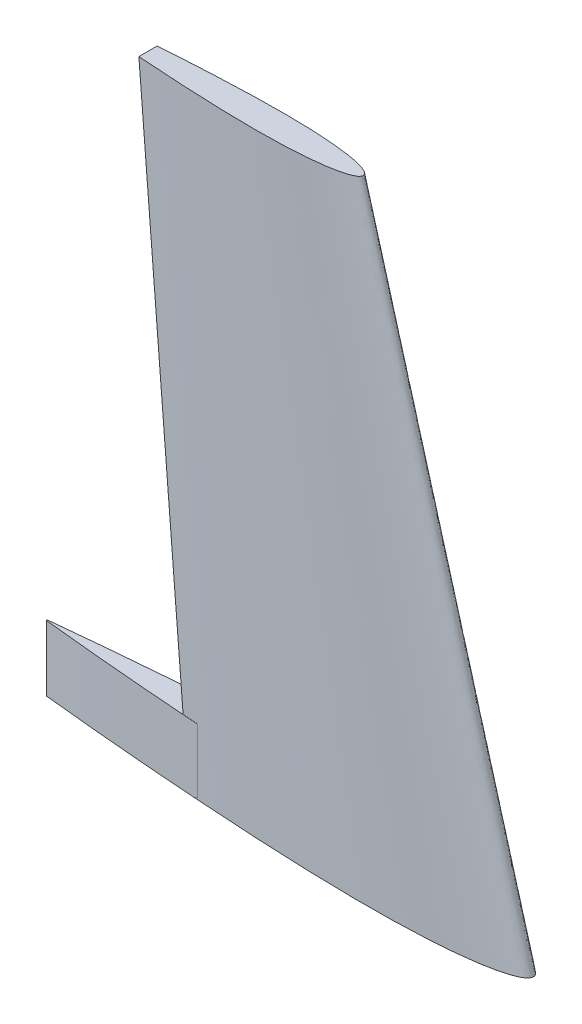
ISO-10303-21;
HEADER;
FILE_DESCRIPTION(('STEP AP214'),'2;1');
FILE_NAME('part.step','',(''),(''),'','','');
FILE_SCHEMA(('AUTOMOTIVE_DESIGN { 1 0 10303 214 1 1 1 1 }'));
ENDSEC;
DATA;
#1=APPLICATION_CONTEXT('core data for automotive mechanical design processes');
#2=APPLICATION_PROTOCOL_DEFINITION('international standard','automotive_design',2000,#1);
#3=PRODUCT_CONTEXT('',#1,'mechanical');
#4=PRODUCT('Part','Part','',(#3));
#5=PRODUCT_RELATED_PRODUCT_CATEGORY('part','',(#4));
#6=PRODUCT_DEFINITION_FORMATION('','',#4);
#7=PRODUCT_DEFINITION_CONTEXT('part definition',#1,'design');
#8=PRODUCT_DEFINITION('design','',#6,#7);
#9=PRODUCT_DEFINITION_SHAPE('','',#8);
#10=(LENGTH_UNIT() NAMED_UNIT(*) SI_UNIT(.MILLI.,.METRE.));
#11=(NAMED_UNIT(*) PLANE_ANGLE_UNIT() SI_UNIT($,.RADIAN.));
#12=(NAMED_UNIT(*) SI_UNIT($,.STERADIAN.) SOLID_ANGLE_UNIT());
#13=UNCERTAINTY_MEASURE_WITH_UNIT(LENGTH_MEASURE(1.E-05),#10,'distance_accuracy_value','');
#14=(GEOMETRIC_REPRESENTATION_CONTEXT(3) GLOBAL_UNCERTAINTY_ASSIGNED_CONTEXT((#13)) GLOBAL_UNIT_ASSIGNED_CONTEXT((#10,
#11,#12)) REPRESENTATION_CONTEXT('',''));
#15=CARTESIAN_POINT('',(0.,0.,0.));
#16=DIRECTION('',(0.,0.,1.));
#17=DIRECTION('',(1.,0.,0.));
#18=AXIS2_PLACEMENT_3D('',#15,#16,#17);
#19=CARTESIAN_POINT('',(-105.416624966874,-9.4452933315154,0.));
#20=DIRECTION('',(0.996009959146229,0.0892421496913133,0.));
#21=DIRECTION('',(-0.0892421496913133,0.996009959146229,0.));
#22=AXIS2_PLACEMENT_3D('',#19,#20,#21);
#23=PLANE('',#22);
#24=DIRECTION('',(0.,0.,-1.));
#25=VECTOR('',#24,1.);
#26=CARTESIAN_POINT('',(-108.144512775562,21.,0.));
#27=LINE('',#26,#25);
#28=CARTESIAN_POINT('',(-108.144512775562,21.,4.34405090672924));
#29=VERTEX_POINT('',#28);
#30=CARTESIAN_POINT('',(-108.144512775562,21.,-4.34405090672924));
#31=VERTEX_POINT('',#30);
#32=EDGE_CURVE('E135',#29,#31,#27,.T.);
#33=ORIENTED_EDGE('',*,*,#32,.F.);
#34=DIRECTION('',(-0.089239254238316,0.995977643698523,-0.00805535571697361));
#35=VECTOR('',#34,1.);
#36=CARTESIAN_POINT('',(-106.26292,0.,4.51389655650534));
#37=LINE('',#36,#35);
#38=CARTESIAN_POINT('',(-123.765048,195.337,2.93403276172847));
#39=VERTEX_POINT('',#38);
#40=EDGE_CURVE('E147',#29,#39,#37,.T.);
#41=ORIENTED_EDGE('',*,*,#40,.T.);
#42=DIRECTION('',(0.,0.,1.));
#43=VECTOR('',#42,1.);
#44=CARTESIAN_POINT('',(-123.765048,195.337,-2.93403276172847));
#45=LINE('',#44,#43);
#46=CARTESIAN_POINT('',(-123.765048,195.337,-2.93403276172847));
#47=VERTEX_POINT('',#46);
#48=EDGE_CURVE('E155',#47,#39,#45,.T.);
#49=ORIENTED_EDGE('',*,*,#48,.F.);
#50=DIRECTION('',(-0.089239254238316,0.995977643698523,0.00805535571697361));
#51=VECTOR('',#50,1.);
#52=CARTESIAN_POINT('',(-106.26292,0.,-4.51389655650534));
#53=LINE('',#52,#51);
#54=EDGE_CURVE('E148',#31,#47,#53,.T.);
#55=ORIENTED_EDGE('',*,*,#54,.F.);
#56=EDGE_LOOP('',(#33,#41,#49,#55));
#57=FACE_BOUND('',#56,.T.);
#58=ADVANCED_FACE('F41',(#57),#23,.F.);
#59=CARTESIAN_POINT('',(-106.26292,0.,4.51389655650534));
#60=CARTESIAN_POINT('',(-123.765048,195.337,2.93403276172847));
#61=CARTESIAN_POINT('',(-104.935148385792,0.,4.60883852491694));
#62=CARTESIAN_POINT('',(-122.901996450765,195.337,2.99574504119601));
#63=CARTESIAN_POINT('',(-100.975243384421,0.,4.89199051546261));
#64=CARTESIAN_POINT('',(-120.328058199873,195.337,3.1797938350507));
#65=CARTESIAN_POINT('',(-94.3217202276288,0.,5.32075207551032));
#66=CARTESIAN_POINT('',(-116.003268147959,195.337,3.45848884908171));
#67=CARTESIAN_POINT('',(-86.273621162137,0.,5.79664795875354));
#68=CARTESIAN_POINT('',(-110.772003755389,195.337,3.7678211731898));
#69=CARTESIAN_POINT('',(-78.136149259993,0.,6.21614827745477));
#70=CARTESIAN_POINT('',(-105.482647018995,195.337,4.0404963803456));
#71=CARTESIAN_POINT('',(-69.9986072735361,0.,6.56668765709037));
#72=CARTESIAN_POINT('',(-100.193244727798,195.337,4.26834697710874));
#73=CARTESIAN_POINT('',(-61.9500363293575,0.,6.83232813720469));
#74=CARTESIAN_POINT('',(-94.9616736140824,195.337,4.44101328918305));
#75=CARTESIAN_POINT('',(-54.0785615843828,0.,6.99901332093482));
#76=CARTESIAN_POINT('',(-89.8452150298488,195.337,4.54935865860763));
#77=CARTESIAN_POINT('',(-46.4703435339196,0.,7.0542730799558));
#78=CARTESIAN_POINT('',(-84.8998732970477,195.337,4.58527750197127));
#79=CARTESIAN_POINT('',(-39.208658660567,0.,6.98847693971698));
#80=CARTESIAN_POINT('',(-80.1797781293685,195.337,4.54251001081604));
#81=CARTESIAN_POINT('',(-32.3729558054138,0.,6.79560836935339));
#82=CARTESIAN_POINT('',(-75.7365712735189,195.337,4.4171454400797));
#83=CARTESIAN_POINT('',(-26.0379974742425,0.,6.47382885938637));
#84=CARTESIAN_POINT('',(-71.6188483582576,195.337,4.20798875860114));
#85=CARTESIAN_POINT('',(-20.2728239547259,0.,6.02596361973304));
#86=CARTESIAN_POINT('',(-67.8714855705718,195.337,3.91687635282647));
#87=CARTESIAN_POINT('',(-15.1403124995387,0.,5.45870010366084));
#88=CARTESIAN_POINT('',(-64.5353531247002,195.337,3.54815506737955));
#89=CARTESIAN_POINT('',(-10.6946859398368,0.,4.78429969624304));
#90=CARTESIAN_POINT('',(-61.6456958608939,195.337,3.10979480255797));
#91=CARTESIAN_POINT('',(-6.98447600208662,0.,4.01326202878222));
#92=CARTESIAN_POINT('',(-59.2340594013563,195.337,2.60862031870844));
#93=CARTESIAN_POINT('',(-4.03684471242268,0.,3.17208660895619));
#94=CARTESIAN_POINT('',(-57.3180990630747,195.337,2.06185629582153));
#95=CARTESIAN_POINT('',(-1.88332812067288,0.,2.24853682955961));
#96=CARTESIAN_POINT('',(-55.9183132784374,195.337,1.46154893921374));
#97=CARTESIAN_POINT('',(-0.448695997297463,0.,1.29439280704104));
#98=CARTESIAN_POINT('',(-54.9858023982434,195.337,0.841355324576678));
#99=CARTESIAN_POINT('',(0.185503199903706,0.,0.));
#100=CARTESIAN_POINT('',(-54.5735729200626,195.337,0.));
#101=CARTESIAN_POINT('',(-0.448695997297476,0.,-1.29439280704106));
#102=CARTESIAN_POINT('',(-54.9858023982434,195.337,-0.841355324576682));
#103=CARTESIAN_POINT('',(-1.88332812067285,0.,-2.24853682955959));
#104=CARTESIAN_POINT('',(-55.9183132784373,195.337,-1.46154893921374));
#105=CARTESIAN_POINT('',(-4.03684471242271,0.,-3.17208660895621));
#106=CARTESIAN_POINT('',(-57.3180990630747,195.337,-2.06185629582153));
#107=CARTESIAN_POINT('',(-6.9844760020866,0.,-4.01326202878221));
#108=CARTESIAN_POINT('',(-59.2340594013563,195.337,-2.60862031870844));
#109=CARTESIAN_POINT('',(-10.6946859398368,0.,-4.78429969624304));
#110=CARTESIAN_POINT('',(-61.6456958608939,195.337,-3.10979480255797));
#111=CARTESIAN_POINT('',(-15.1403124995387,0.,-5.45870010366084));
#112=CARTESIAN_POINT('',(-64.5353531247002,195.337,-3.54815506737955));
#113=CARTESIAN_POINT('',(-20.2728239547259,0.,-6.02596361973303));
#114=CARTESIAN_POINT('',(-67.8714855705718,195.337,-3.91687635282647));
#115=CARTESIAN_POINT('',(-26.0379974742425,0.,-6.47382885938637));
#116=CARTESIAN_POINT('',(-71.6188483582576,195.337,-4.20798875860114));
#117=CARTESIAN_POINT('',(-32.3729558054138,0.,-6.79560836935339));
#118=CARTESIAN_POINT('',(-75.7365712735189,195.337,-4.4171454400797));
#119=CARTESIAN_POINT('',(-39.208658660567,0.,-6.98847693971698));
#120=CARTESIAN_POINT('',(-80.1797781293685,195.337,-4.54251001081604));
#121=CARTESIAN_POINT('',(-46.4703435339196,0.,-7.0542730799558));
#122=CARTESIAN_POINT('',(-84.8998732970477,195.337,-4.58527750197127));
#123=CARTESIAN_POINT('',(-54.0785615843828,0.,-6.99901332093482));
#124=CARTESIAN_POINT('',(-89.8452150298488,195.337,-4.54935865860763));
#125=CARTESIAN_POINT('',(-61.9500363293575,0.,-6.83232813720468));
#126=CARTESIAN_POINT('',(-94.9616736140824,195.337,-4.44101328918305));
#127=CARTESIAN_POINT('',(-69.9986072735361,0.,-6.56668765709037));
#128=CARTESIAN_POINT('',(-100.193244727798,195.337,-4.26834697710874));
#129=CARTESIAN_POINT('',(-78.136149259993,0.,-6.21614827745477));
#130=CARTESIAN_POINT('',(-105.482647018995,195.337,-4.0404963803456));
#131=CARTESIAN_POINT('',(-86.273621162137,0.,-5.79664795875354));
#132=CARTESIAN_POINT('',(-110.772003755389,195.337,-3.7678211731898));
#133=CARTESIAN_POINT('',(-94.3217202276288,0.,-5.32075207551033));
#134=CARTESIAN_POINT('',(-116.003268147959,195.337,-3.45848884908171));
#135=CARTESIAN_POINT('',(-100.975243384421,0.,-4.89199051546262));
#136=CARTESIAN_POINT('',(-120.328058199873,195.337,-3.1797938350507));
#137=CARTESIAN_POINT('',(-104.935148385792,0.,-4.60883852491694));
#138=CARTESIAN_POINT('',(-122.901996450765,195.337,-2.99574504119601));
#139=CARTESIAN_POINT('',(-106.26292,0.,-4.51389655650534));
#140=CARTESIAN_POINT('',(-123.765048,195.337,-2.93403276172847));
#141=B_SPLINE_SURFACE_WITH_KNOTS('',3,1,((#59,#60),(#61,#62),(#63,#64),(#65,#66),(#67,#68),(#69,
#70),(#71,#72),(#73,#74),(#75,#76),(#77,#78),(#79,#80),(#81,#82),(#83,#84),(#85,#86),(#87,#88),
(#89,#90),(#91,#92),(#93,#94),(#95,#96),(#97,#98),(#99,#100),(#101,#102),(#103,#104),(#105,
#106),(#107,#108),(#109,#110),(#111,#112),(#113,#114),(#115,#116),(#117,#118),(#119,#120),(#121,
#122),(#123,#124),(#125,#126),(#127,#128),(#129,#130),(#131,#132),(#133,#134),(#135,#136),(#137,
#138),(#139,#140)),.UNSPECIFIED.,.F.,.F.,.F.,(4,1,1,1,1,1,1,1,1,1,1,1,1,1,1,1,1,1,1,1,1,1,1,1,1,
1,1,1,1,1,1,1,1,1,1,1,1,1,4),(2,2),(0.,0.0184991990313921,0.0551714391103743,0.0926551947459052,
0.130538861378944,0.168407204268983,0.205846371784387,0.242448967142613,0.277819055280114,
0.31157698184847,0.343363918285861,0.372846133093968,0.399719140493533,0.423712132827816,
0.44459359078009,0.462180115204489,0.476353861047873,0.487105624794223,0.494669112548724,0.5,
0.505330887451276,0.512894375205777,0.523646138952127,0.537819884795511,0.55540640921991,
0.576287867172184,0.600280859506467,0.627153866906032,0.656636081714139,0.68842301815153,
0.722180944719886,0.757551032857387,0.794153628215613,0.831592795731017,0.869461138621057,
0.907344805254095,0.944828560889626,0.981500800968608,1.),(0.,1.),.UNSPECIFIED.);
#142=CARTESIAN_POINT('',(-103.13754,21.,4.69543432229981));
#143=CARTESIAN_POINT('',(-103.13754,20.0316183741775,4.69741197071201));
#144=CARTESIAN_POINT('',(-103.13754,19.0632367143761,4.69937306409232));
#145=CARTESIAN_POINT('',(-103.13754,14.221328243875,4.70909746222528));
#146=CARTESIAN_POINT('',(-103.13754,10.3478009421188,4.71661756062393));
#147=CARTESIAN_POINT('',(-103.13754,4.49002432531027,4.72763061578024));
#148=CARTESIAN_POINT('',(-103.13754,2.50577533797844,4.73129880827757));
#149=CARTESIAN_POINT('',(-103.13754,0.521526244739116,4.73490759398345));
#150=B_SPLINE_CURVE_WITH_KNOTS('',3,(#142,#143,#144,#145,#146,#147,#148,#149),.UNSPECIFIED.,.F.,
.F.,(4,2,2,4),(0.,2.90515093603481,14.5257547035983,20.4785118321649),.UNSPECIFIED.);
#151=CARTESIAN_POINT('',(-103.13754,21.,4.69543432229981));
#152=VERTEX_POINT('',#151);
#153=CARTESIAN_POINT('',(-103.13754,0.521526244739116,4.73490759398345));
#154=VERTEX_POINT('',#153);
#155=EDGE_CURVE('E54',#152,#154,#150,.T.);
#156=CARTESIAN_POINT('',(-103.13754,0.521526244739116,4.73490759398345));
#157=CARTESIAN_POINT('',(-103.178156783246,0.51436931466218,4.73207748481404));
#158=CARTESIAN_POINT('',(-103.218534042624,0.505915928756793,4.7292640622419));
#159=CARTESIAN_POINT('',(-103.298635653167,0.486669806677132,4.72368263285552));
#160=CARTESIAN_POINT('',(-103.338361271005,0.475882387126029,4.72091453795705));
#161=CARTESIAN_POINT('',(-103.417146917797,0.452194215810133,4.71542457647914));
#162=CARTESIAN_POINT('',(-103.456207316936,0.439294684852946,4.7127026841916));
#163=CARTESIAN_POINT('',(-103.609836434362,0.384372556105459,4.70199672642774));
#164=CARTESIAN_POINT('',(-103.721815727972,0.334970481147947,4.69419224320251));
#165=CARTESIAN_POINT('',(-103.912290522944,0.238759417375553,4.68091408260757));
#166=CARTESIAN_POINT('',(-103.992105285487,0.194441502863226,4.67534918321501));
#167=CARTESIAN_POINT('',(-104.110056850754,0.12422479386811,4.66712356130507));
#168=CARTESIAN_POINT('',(-104.149240925758,0.100085733385048,4.66439067392685));
#169=CARTESIAN_POINT('',(-104.226955374551,0.0507754951375784,4.65896985281537));
#170=CARTESIAN_POINT('',(-104.265485782512,0.025604371562729,4.65628191673231));
#171=CARTESIAN_POINT('',(-104.303721706896,0.,4.65361417981223));
#172=B_SPLINE_CURVE_WITH_KNOTS('',3,(#156,#157,#158,#159,#160,#161,#162,#163,#164,#165,#166,
#167,#168,#169,#170,#171),.UNSPECIFIED.,.F.,.F.,(4,2,2,2,2,2,2,4),(0.,0.123980883727061,
0.247682273861098,0.371312414948054,0.738101097831173,1.01233903621264,1.15063335150311,
1.28892041478041),.UNSPECIFIED.);
#173=CARTESIAN_POINT('',(-104.303715246416,0.,4.65361463806408));
#174=VERTEX_POINT('',#173);
#175=EDGE_CURVE('E11',#154,#174,#172,.T.);
#176=CARTESIAN_POINT('',(-106.26292,0.,4.51389655650534));
#177=CARTESIAN_POINT('',(-104.935148385792,0.,4.60883852491694));
#178=CARTESIAN_POINT('',(-100.975243384421,0.,4.89199051546261));
#179=CARTESIAN_POINT('',(-94.3217202276288,0.,5.32075207551032));
#180=CARTESIAN_POINT('',(-86.273621162137,0.,5.79664795875354));
#181=CARTESIAN_POINT('',(-78.136149259993,0.,6.21614827745477));
#182=CARTESIAN_POINT('',(-69.9986072735361,0.,6.56668765709037));
#183=CARTESIAN_POINT('',(-61.9500363293575,0.,6.83232813720469));
#184=CARTESIAN_POINT('',(-54.0785615843828,0.,6.99901332093482));
#185=CARTESIAN_POINT('',(-46.4703435339196,0.,7.0542730799558));
#186=CARTESIAN_POINT('',(-39.208658660567,0.,6.98847693971698));
#187=CARTESIAN_POINT('',(-32.3729558054138,0.,6.79560836935339));
#188=CARTESIAN_POINT('',(-26.0379974742425,0.,6.47382885938637));
#189=CARTESIAN_POINT('',(-20.2728239547259,0.,6.02596361973304));
#190=CARTESIAN_POINT('',(-15.1403124995387,0.,5.45870010366084));
#191=CARTESIAN_POINT('',(-10.6946859398368,0.,4.78429969624304));
#192=CARTESIAN_POINT('',(-6.98447600208662,0.,4.01326202878222));
#193=CARTESIAN_POINT('',(-4.03684471242268,0.,3.17208660895619));
#194=CARTESIAN_POINT('',(-1.88332812067288,0.,2.24853682955961));
#195=CARTESIAN_POINT('',(-0.448695997297463,0.,1.29439280704104));
#196=CARTESIAN_POINT('',(0.185503199903706,0.,0.));
#197=CARTESIAN_POINT('',(-0.448695997297476,0.,-1.29439280704106));
#198=CARTESIAN_POINT('',(-1.88332812067285,0.,-2.24853682955959));
#199=CARTESIAN_POINT('',(-4.03684471242271,0.,-3.17208660895621));
#200=CARTESIAN_POINT('',(-6.9844760020866,0.,-4.01326202878221));
#201=CARTESIAN_POINT('',(-10.6946859398368,0.,-4.78429969624304));
#202=CARTESIAN_POINT('',(-15.1403124995387,0.,-5.45870010366084));
#203=CARTESIAN_POINT('',(-20.2728239547259,0.,-6.02596361973303));
#204=CARTESIAN_POINT('',(-26.0379974742425,0.,-6.47382885938637));
#205=CARTESIAN_POINT('',(-32.3729558054138,0.,-6.79560836935339));
#206=CARTESIAN_POINT('',(-39.208658660567,0.,-6.98847693971698));
#207=CARTESIAN_POINT('',(-46.4703435339196,0.,-7.0542730799558));
#208=CARTESIAN_POINT('',(-54.0785615843828,0.,-6.99901332093482));
#209=CARTESIAN_POINT('',(-61.9500363293575,0.,-6.83232813720468));
#210=CARTESIAN_POINT('',(-69.9986072735361,0.,-6.56668765709037));
#211=CARTESIAN_POINT('',(-78.136149259993,0.,-6.21614827745477));
#212=CARTESIAN_POINT('',(-86.273621162137,0.,-5.79664795875354));
#213=CARTESIAN_POINT('',(-94.3217202276288,0.,-5.32075207551033));
#214=CARTESIAN_POINT('',(-100.975243384421,0.,-4.89199051546262));
#215=CARTESIAN_POINT('',(-104.935148385792,0.,-4.60883852491694));
#216=CARTESIAN_POINT('',(-106.26292,0.,-4.51389655650534));
#217=B_SPLINE_CURVE_WITH_KNOTS('',3,(#176,#177,#178,#179,#180,#181,#182,#183,#184,#185,#186,
#187,#188,#189,#190,#191,#192,#193,#194,#195,#196,#197,#198,#199,#200,#201,#202,#203,#204,#205,
#206,#207,#208,#209,#210,#211,#212,#213,#214,#215,#216),.UNSPECIFIED.,.F.,.F.,(4,1,1,1,1,1,1,1,
1,1,1,1,1,1,1,1,1,1,1,1,1,1,1,1,1,1,1,1,1,1,1,1,1,1,1,1,1,1,4),(0.,0.0184991990313921,
0.0551714391103743,0.0926551947459052,0.130538861378944,0.168407204268983,0.205846371784387,
0.242448967142613,0.277819055280114,0.31157698184847,0.343363918285861,0.372846133093968,
0.399719140493533,0.423712132827816,0.44459359078009,0.462180115204489,0.476353861047873,
0.487105624794223,0.494669112548724,0.5,0.505330887451276,0.512894375205777,0.523646138952127,
0.537819884795511,0.55540640921991,0.576287867172184,0.600280859506467,0.627153866906032,
0.656636081714139,0.68842301815153,0.722180944719886,0.757551032857387,0.794153628215613,
0.831592795731017,0.869461138621057,0.907344805254095,0.944828560889626,0.981500800968608,1.),.UNSPECIFIED.);
#218=CARTESIAN_POINT('',(-104.303715246411,0.,-4.65361463806438));
#219=VERTEX_POINT('',#218);
#220=EDGE_CURVE('E138',#174,#219,#217,.T.);
#221=CARTESIAN_POINT('',(-104.3037217069,0.,-4.65361417981194));
#222=CARTESIAN_POINT('',(-104.25511896038,0.0325399247343756,-4.65700521512348));
#223=CARTESIAN_POINT('',(-104.206039961357,0.0643903190124317,-4.66042891689702));
#224=CARTESIAN_POINT('',(-104.106543814112,0.126507293520077,-4.66736863626147));
#225=CARTESIAN_POINT('',(-104.056121052507,0.156764818022792,-4.6708850400915));
#226=CARTESIAN_POINT('',(-103.953960233892,0.21519936765475,-4.67800864325919));
#227=CARTESIAN_POINT('',(-103.902219965956,0.243372536784147,-4.68161599510177));
#228=CARTESIAN_POINT('',(-103.798537128651,0.296536740983262,-4.68884400568155));
#229=CARTESIAN_POINT('',(-103.746623119664,0.321583406543829,-4.6924626904233));
#230=CARTESIAN_POINT('',(-103.641539411044,0.368648737873837,-4.69978695370347));
#231=CARTESIAN_POINT('',(-103.588371909745,0.390672300903657,-4.70349238004663));
#232=CARTESIAN_POINT('',(-103.480762582265,0.431147011764918,-4.71099156937413));
#233=CARTESIAN_POINT('',(-103.426322498756,0.44960275704963,-4.71478521152249));
#234=CARTESIAN_POINT('',(-103.332958802477,0.477372583453444,-4.72129098601125));
#235=CARTESIAN_POINT('',(-103.294352718741,0.487759721616174,-4.72398106712428));
#236=CARTESIAN_POINT('',(-103.21642288543,0.506356766048033,-4.72941116396306));
#237=CARTESIAN_POINT('',(-103.177096536772,0.514555690793071,-4.73215136043614));
#238=CARTESIAN_POINT('',(-103.13754,0.52152624474047,-4.73490759398343));
#239=B_SPLINE_CURVE_WITH_KNOTS('',3,(#221,#222,#223,#224,#225,#226,#227,#228,#229,#230,#231,
#232,#233,#234,#235,#236,#237,#238),.UNSPECIFIED.,.F.,.F.,(4,2,2,2,2,2,2,2,4),(0.,
0.175779532273966,0.352469322155728,0.529478208064806,0.702660019529497,0.875557888881678,
1.04823145662731,1.16837887674185,1.28911837658366),.UNSPECIFIED.);
#240=CARTESIAN_POINT('',(-103.13754,0.521526244739304,-4.73490759398345));
#241=VERTEX_POINT('',#240);
#242=EDGE_CURVE('E194',#219,#241,#239,.T.);
#243=CARTESIAN_POINT('',(-103.13754,0.521526244739304,-4.73490759398345));
#244=CARTESIAN_POINT('',(-103.13754,1.48990828486941,-4.73314460613786));
#245=CARTESIAN_POINT('',(-103.13754,2.45829030099775,-4.73136817566528));
#246=CARTESIAN_POINT('',(-103.13754,7.30020026072589,-4.72241613595554));
#247=CARTESIAN_POINT('',(-103.13754,11.1737278205509,-4.71503086471597));
#248=CARTESIAN_POINT('',(-103.13754,17.0315033850086,-4.70347245791399));
#249=CARTESIAN_POINT('',(-103.13754,19.0157517663189,-4.69948952433037));
#250=CARTESIAN_POINT('',(-103.13754,21.,-4.69543432229981));
#251=B_SPLINE_CURVE_WITH_KNOTS('',3,(#243,#244,#245,#246,#247,#248,#249,#250),.UNSPECIFIED.,.F.,
.F.,(4,2,2,4),(0.,2.90515093588889,14.5257547004785,20.4785118322834),.UNSPECIFIED.);
#252=CARTESIAN_POINT('',(-103.13754,21.,-4.69543432229981));
#253=VERTEX_POINT('',#252);
#254=EDGE_CURVE('E172',#241,#253,#251,.T.);
#255=CARTESIAN_POINT('',(-103.13754,21.,-4.69543432229981));
#256=CARTESIAN_POINT('',(-103.379083353659,21.,-4.67907808586213));
#257=CARTESIAN_POINT('',(-103.620619423123,21.,-4.66261433822258));
#258=CARTESIAN_POINT('',(-104.103677141591,21.,-4.62947768573136));
#259=CARTESIAN_POINT('',(-104.345198790599,21.,-4.61280478094315));
#260=CARTESIAN_POINT('',(-105.069742088525,21.,-4.56248114561015));
#261=CARTESIAN_POINT('',(-105.552742548489,21.,-4.52852546291567));
#262=CARTESIAN_POINT('',(-106.387202445099,21.,-4.46945418538356));
#263=CARTESIAN_POINT('',(-106.738669735355,21.,-4.44444897971668));
#264=CARTESIAN_POINT('',(-107.441595640007,21.,-4.39431318405807));
#265=CARTESIAN_POINT('',(-107.793054254397,21.,-4.36918259397414));
#266=CARTESIAN_POINT('',(-108.144512775562,21.,-4.34405090672924));
#267=B_SPLINE_CURVE_WITH_KNOTS('',3,(#255,#256,#257,#258,#259,#260,#261,#262,#263,#264,#265,
#266),.UNSPECIFIED.,.F.,.F.,(4,2,2,2,2,4),(0.,0.726289488694294,1.4525787570991,
2.90515591030999,3.96222290706964,5.01929068109569),.UNSPECIFIED.);
#268=EDGE_CURVE('E158',#253,#31,#267,.T.);
#269=CARTESIAN_POINT('',(-123.765048,195.337,2.93403276172847));
#270=CARTESIAN_POINT('',(-122.901996450765,195.337,2.99574504119601));
#271=CARTESIAN_POINT('',(-120.328058199873,195.337,3.1797938350507));
#272=CARTESIAN_POINT('',(-116.003268147959,195.337,3.45848884908171));
#273=CARTESIAN_POINT('',(-110.772003755389,195.337,3.7678211731898));
#274=CARTESIAN_POINT('',(-105.482647018995,195.337,4.0404963803456));
#275=CARTESIAN_POINT('',(-100.193244727798,195.337,4.26834697710874));
#276=CARTESIAN_POINT('',(-94.9616736140824,195.337,4.44101328918305));
#277=CARTESIAN_POINT('',(-89.8452150298488,195.337,4.54935865860763));
#278=CARTESIAN_POINT('',(-84.8998732970477,195.337,4.58527750197127));
#279=CARTESIAN_POINT('',(-80.1797781293685,195.337,4.54251001081604));
#280=CARTESIAN_POINT('',(-75.7365712735189,195.337,4.4171454400797));
#281=CARTESIAN_POINT('',(-71.6188483582576,195.337,4.20798875860114));
#282=CARTESIAN_POINT('',(-67.8714855705718,195.337,3.91687635282647));
#283=CARTESIAN_POINT('',(-64.5353531247002,195.337,3.54815506737955));
#284=CARTESIAN_POINT('',(-61.6456958608939,195.337,3.10979480255797));
#285=CARTESIAN_POINT('',(-59.2340594013563,195.337,2.60862031870844));
#286=CARTESIAN_POINT('',(-57.3180990630747,195.337,2.06185629582153));
#287=CARTESIAN_POINT('',(-55.9183132784374,195.337,1.46154893921374));
#288=CARTESIAN_POINT('',(-54.9858023982434,195.337,0.841355324576678));
#289=CARTESIAN_POINT('',(-54.5735729200626,195.337,0.));
#290=CARTESIAN_POINT('',(-54.9858023982434,195.337,-0.841355324576682));
#291=CARTESIAN_POINT('',(-55.9183132784373,195.337,-1.46154893921374));
#292=CARTESIAN_POINT('',(-57.3180990630747,195.337,-2.06185629582153));
#293=CARTESIAN_POINT('',(-59.2340594013563,195.337,-2.60862031870844));
#294=CARTESIAN_POINT('',(-61.6456958608939,195.337,-3.10979480255797));
#295=CARTESIAN_POINT('',(-64.5353531247002,195.337,-3.54815506737955));
#296=CARTESIAN_POINT('',(-67.8714855705718,195.337,-3.91687635282647));
#297=CARTESIAN_POINT('',(-71.6188483582576,195.337,-4.20798875860114));
#298=CARTESIAN_POINT('',(-75.7365712735189,195.337,-4.4171454400797));
#299=CARTESIAN_POINT('',(-80.1797781293685,195.337,-4.54251001081604));
#300=CARTESIAN_POINT('',(-84.8998732970477,195.337,-4.58527750197127));
#301=CARTESIAN_POINT('',(-89.8452150298488,195.337,-4.54935865860763));
#302=CARTESIAN_POINT('',(-94.9616736140824,195.337,-4.44101328918305));
#303=CARTESIAN_POINT('',(-100.193244727798,195.337,-4.26834697710874));
#304=CARTESIAN_POINT('',(-105.482647018995,195.337,-4.0404963803456));
#305=CARTESIAN_POINT('',(-110.772003755389,195.337,-3.7678211731898));
#306=CARTESIAN_POINT('',(-116.003268147959,195.337,-3.45848884908171));
#307=CARTESIAN_POINT('',(-120.328058199873,195.337,-3.1797938350507));
#308=CARTESIAN_POINT('',(-122.901996450765,195.337,-2.99574504119601));
#309=CARTESIAN_POINT('',(-123.765048,195.337,-2.93403276172847));
#310=B_SPLINE_CURVE_WITH_KNOTS('',3,(#269,#270,#271,#272,#273,#274,#275,#276,#277,#278,#279,
#280,#281,#282,#283,#284,#285,#286,#287,#288,#289,#290,#291,#292,#293,#294,#295,#296,#297,#298,
#299,#300,#301,#302,#303,#304,#305,#306,#307,#308,#309),.UNSPECIFIED.,.F.,.F.,(4,1,1,1,1,1,1,1,
1,1,1,1,1,1,1,1,1,1,1,1,1,1,1,1,1,1,1,1,1,1,1,1,1,1,1,1,1,1,4),(0.,0.0184991990313921,
0.0551714391103743,0.0926551947459052,0.130538861378944,0.168407204268983,0.205846371784387,
0.242448967142613,0.277819055280114,0.31157698184847,0.343363918285861,0.372846133093968,
0.399719140493533,0.423712132827816,0.44459359078009,0.462180115204489,0.476353861047873,
0.487105624794223,0.494669112548724,0.5,0.505330887451276,0.512894375205777,0.523646138952127,
0.537819884795511,0.55540640921991,0.576287867172184,0.600280859506467,0.627153866906032,
0.656636081714139,0.68842301815153,0.722180944719886,0.757551032857387,0.794153628215613,
0.831592795731017,0.869461138621057,0.907344805254095,0.944828560889626,0.981500800968608,1.),.UNSPECIFIED.);
#311=EDGE_CURVE('E153',#39,#47,#310,.T.);
#312=CARTESIAN_POINT('',(-108.144512775562,21.,4.34405090672924));
#313=CARTESIAN_POINT('',(-107.661553479157,21.,4.37858013999617));
#314=CARTESIAN_POINT('',(-107.178594438659,21.,4.41311632602083));
#315=CARTESIAN_POINT('',(-106.212653840045,21.,4.48186334680713));
#316=CARTESIAN_POINT('',(-105.729672281956,21.,4.51607418197067));
#317=CARTESIAN_POINT('',(-104.895174535368,21.,4.57460690605361));
#318=CARTESIAN_POINT('',(-104.543669340701,21.,4.59908509769259));
#319=CARTESIAN_POINT('',(-103.840628637794,21.,4.64760661180659));
#320=CARTESIAN_POINT('',(-103.489093129528,21.,4.67164993389062));
#321=CARTESIAN_POINT('',(-103.13754,21.,4.69543432229981));
#322=B_SPLINE_CURVE_WITH_KNOTS('',3,(#312,#313,#314,#315,#316,#317,#318,#319,#320,#321),
.UNSPECIFIED.,.F.,.F.,(4,2,2,2,4),(0.,1.45257659393113,2.90515139327907,3.96222054570458,
5.01929064850085),.UNSPECIFIED.);
#323=EDGE_CURVE('E64',#29,#152,#322,.T.);
#324=ORIENTED_EDGE('',*,*,#155,.T.);
#325=ORIENTED_EDGE('',*,*,#175,.T.);
#326=ORIENTED_EDGE('',*,*,#220,.T.);
#327=ORIENTED_EDGE('',*,*,#242,.T.);
#328=ORIENTED_EDGE('',*,*,#254,.T.);
#329=ORIENTED_EDGE('',*,*,#268,.T.);
#330=ORIENTED_EDGE('',*,*,#54,.T.);
#331=ORIENTED_EDGE('',*,*,#311,.F.);
#332=ORIENTED_EDGE('',*,*,#40,.F.);
#333=ORIENTED_EDGE('',*,*,#323,.T.);
#334=EDGE_LOOP('',(#324,#325,#326,#327,#328,#329,#330,#331,#332,#333));
#335=FACE_BOUND('',#334,.T.);
#336=ADVANCED_FACE('F179',(#335),#141,.T.);
#337=CARTESIAN_POINT('',(-54.69415,195.337,0.));
#338=DIRECTION('',(0.,1.,0.));
#339=DIRECTION('',(0.,0.,1.));
#340=AXIS2_PLACEMENT_3D('',#337,#338,#339);
#341=PLANE('',#340);
#342=ORIENTED_EDGE('',*,*,#311,.T.);
#343=ORIENTED_EDGE('',*,*,#48,.T.);
#344=EDGE_LOOP('',(#342,#343));
#345=FACE_BOUND('',#344,.T.);
#346=ADVANCED_FACE('F43',(#345),#341,.T.);
#347=CARTESIAN_POINT('',(0.,0.,0.));
#348=DIRECTION('',(0.,1.,0.));
#349=DIRECTION('',(0.,0.,1.));
#350=AXIS2_PLACEMENT_3D('',#347,#348,#349);
#351=PLANE('',#350);
#352=ORIENTED_EDGE('',*,*,#220,.F.);
#353=CARTESIAN_POINT('',(-156.269,0.,0.147674204999997));
#354=CARTESIAN_POINT('',(-156.126324673745,0.,0.162672460558929));
#355=CARTESIAN_POINT('',(-155.557217693711,0.,0.222497884835168));
#356=CARTESIAN_POINT('',(-154.282577702691,0.,0.355464771461951));
#357=CARTESIAN_POINT('',(-152.173695683528,0.,0.572621393429135));
#358=CARTESIAN_POINT('',(-149.253651636172,0.,0.867426471120156));
#359=CARTESIAN_POINT('',(-145.55442590309,0.,1.2315241864207));
#360=CARTESIAN_POINT('',(-141.116532573171,0.,1.65505476406373));
#361=CARTESIAN_POINT('',(-135.988588230402,0.,2.12723902921268));
#362=CARTESIAN_POINT('',(-130.226770869043,0.,2.63664728988475));
#363=CARTESIAN_POINT('',(-123.89423090623,0.,3.1718306730886));
#364=CARTESIAN_POINT('',(-117.06028387594,0.,3.71975983211509));
#365=CARTESIAN_POINT('',(-110.08605344099,0.,4.25074657699947));
#366=CARTESIAN_POINT('',(-105.396749736158,0.,4.57748956597966));
#367=CARTESIAN_POINT('',(-103.13754,0.,4.73490759398345));
#368=B_SPLINE_CURVE_WITH_KNOTS('',3,(#353,#354,#355,#356,#357,#358,#359,#360,#361,#362,#363,
#364,#365,#366,#367),.UNSPECIFIED.,.F.,.F.,(4,1,1,1,1,1,1,1,1,1,1,1,4),(0.,0.00806992419661301,
0.0321895194439435,0.0720894725721875,0.127324923855723,0.197281241513437,0.281181722650916,
0.378096945041151,0.486955528822678,0.606556134629911,0.735580601250078,0.872608191388973,1.),.UNSPECIFIED.);
#369=CARTESIAN_POINT('',(-156.269,0.,0.147674204999997));
#370=VERTEX_POINT('',#369);
#371=EDGE_CURVE('E128',#370,#174,#368,.T.);
#372=ORIENTED_EDGE('',*,*,#371,.F.);
#373=DIRECTION('',(0.,0.,1.));
#374=VECTOR('',#373,1.);
#375=CARTESIAN_POINT('',(-156.269,0.,-0.147674204999997));
#376=LINE('',#375,#374);
#377=CARTESIAN_POINT('',(-156.269,0.,-0.147674204999997));
#378=VERTEX_POINT('',#377);
#379=EDGE_CURVE('E256',#378,#370,#376,.T.);
#380=ORIENTED_EDGE('',*,*,#379,.F.);
#381=CARTESIAN_POINT('',(-103.13754,0.,-4.73490759398345));
#382=CARTESIAN_POINT('',(-105.396749736158,0.,-4.57748956597966));
#383=CARTESIAN_POINT('',(-110.08605344099,0.,-4.25074657699947));
#384=CARTESIAN_POINT('',(-117.06028387594,0.,-3.71975983211509));
#385=CARTESIAN_POINT('',(-123.89423090623,0.,-3.1718306730886));
#386=CARTESIAN_POINT('',(-130.226770869043,0.,-2.63664728988475));
#387=CARTESIAN_POINT('',(-135.988588230402,0.,-2.12723902921268));
#388=CARTESIAN_POINT('',(-141.116532573171,0.,-1.65505476406373));
#389=CARTESIAN_POINT('',(-145.55442590309,0.,-1.2315241864207));
#390=CARTESIAN_POINT('',(-149.253651636172,0.,-0.867426471120156));
#391=CARTESIAN_POINT('',(-152.173695683528,0.,-0.572621393429135));
#392=CARTESIAN_POINT('',(-154.282577702691,0.,-0.355464771461951));
#393=CARTESIAN_POINT('',(-155.557217693711,0.,-0.222497884835168));
#394=CARTESIAN_POINT('',(-156.126324673745,0.,-0.162672460558929));
#395=CARTESIAN_POINT('',(-156.269,0.,-0.147674204999997));
#396=B_SPLINE_CURVE_WITH_KNOTS('',3,(#381,#382,#383,#384,#385,#386,#387,#388,#389,#390,#391,
#392,#393,#394,#395),.UNSPECIFIED.,.F.,.F.,(4,1,1,1,1,1,1,1,1,1,1,1,4),(0.,0.127391808611027,
0.264419398749922,0.393443865370089,0.513044471177322,0.621903054958849,0.718818277349084,
0.802718758486563,0.872675076144277,0.927910527427813,0.967810480556056,0.991930075803387,1.),.UNSPECIFIED.);
#397=EDGE_CURVE('E133',#219,#378,#396,.T.);
#398=ORIENTED_EDGE('',*,*,#397,.F.);
#399=EDGE_LOOP('',(#352,#372,#380,#398));
#400=FACE_BOUND('',#399,.T.);
#401=ADVANCED_FACE('F209',(#400),#351,.F.);
#402=CARTESIAN_POINT('',(-103.13754,21.,-4.73490759398345));
#403=DIRECTION('',(-1.,0.,0.));
#404=DIRECTION('',(0.,0.,1.));
#405=AXIS2_PLACEMENT_3D('',#402,#403,#404);
#406=PLANE('',#405);
#407=ORIENTED_EDGE('',*,*,#155,.F.);
#408=DIRECTION('',(0.,0.,-1.));
#409=VECTOR('',#408,1.);
#410=CARTESIAN_POINT('',(-103.13754,21.,-4.73490759398345));
#411=LINE('',#410,#409);
#412=CARTESIAN_POINT('',(-103.13754,21.,4.73490759398345));
#413=VERTEX_POINT('',#412);
#414=EDGE_CURVE('E221',#413,#152,#411,.T.);
#415=ORIENTED_EDGE('',*,*,#414,.F.);
#416=DIRECTION('',(0.,-1.,0.));
#417=VECTOR('',#416,1.);
#418=CARTESIAN_POINT('',(-103.13754,21.,4.73490759398345));
#419=LINE('',#418,#417);
#420=EDGE_CURVE('E140',#413,#154,#419,.T.);
#421=ORIENTED_EDGE('',*,*,#420,.T.);
#422=EDGE_LOOP('',(#407,#415,#421));
#423=FACE_BOUND('',#422,.T.);
#424=ADVANCED_FACE('F208',(#423),#406,.F.);
#425=CARTESIAN_POINT('',(-103.13754,21.,-4.73490759398345));
#426=CARTESIAN_POINT('',(-105.396749736158,21.,-4.57748956597966));
#427=CARTESIAN_POINT('',(-110.08605344099,21.,-4.25074657699947));
#428=CARTESIAN_POINT('',(-117.06028387594,21.,-3.71975983211509));
#429=CARTESIAN_POINT('',(-123.89423090623,21.,-3.1718306730886));
#430=CARTESIAN_POINT('',(-130.226770869043,21.,-2.63664728988475));
#431=CARTESIAN_POINT('',(-135.988588230402,21.,-2.12723902921268));
#432=CARTESIAN_POINT('',(-141.116532573171,21.,-1.65505476406373));
#433=CARTESIAN_POINT('',(-145.55442590309,21.,-1.2315241864207));
#434=CARTESIAN_POINT('',(-149.253651636172,21.,-0.867426471120156));
#435=CARTESIAN_POINT('',(-152.173695683528,21.,-0.572621393429135));
#436=CARTESIAN_POINT('',(-154.282577702691,21.,-0.355464771461951));
#437=CARTESIAN_POINT('',(-155.557217693711,21.,-0.222497884835168));
#438=CARTESIAN_POINT('',(-156.126324673745,21.,-0.162672460558929));
#439=CARTESIAN_POINT('',(-156.269,21.,-0.147674204999997));
#440=B_SPLINE_CURVE_WITH_KNOTS('',3,(#425,#426,#427,#428,#429,#430,#431,#432,#433,#434,#435,
#436,#437,#438,#439),.UNSPECIFIED.,.F.,.F.,(4,1,1,1,1,1,1,1,1,1,1,1,4),(0.,0.127391808611027,
0.264419398749922,0.393443865370089,0.513044471177322,0.621903054958849,0.718818277349084,
0.802718758486563,0.872675076144277,0.927910527427813,0.967810480556056,0.991930075803387,1.),.UNSPECIFIED.);
#441=DIRECTION('',(0.,-1.,0.));
#442=VECTOR('',#441,1.);
#443=SURFACE_OF_LINEAR_EXTRUSION('',#440,#442);
#444=ORIENTED_EDGE('',*,*,#242,.F.);
#445=ORIENTED_EDGE('',*,*,#397,.T.);
#446=DIRECTION('',(0.,-1.,0.));
#447=VECTOR('',#446,1.);
#448=CARTESIAN_POINT('',(-156.269,21.,-0.147674204999997));
#449=LINE('',#448,#447);
#450=CARTESIAN_POINT('',(-156.269,21.,-0.147674204999997));
#451=VERTEX_POINT('',#450);
#452=EDGE_CURVE('E112',#451,#378,#449,.T.);
#453=ORIENTED_EDGE('',*,*,#452,.F.);
#454=CARTESIAN_POINT('',(-103.13754,21.,-4.73490759398345));
#455=VERTEX_POINT('',#454);
#456=EDGE_CURVE('E118',#455,#451,#440,.T.);
#457=ORIENTED_EDGE('',*,*,#456,.F.);
#458=DIRECTION('',(0.,-1.,0.));
#459=VECTOR('',#458,1.);
#460=CARTESIAN_POINT('',(-103.13754,21.,-4.73490759398345));
#461=LINE('',#460,#459);
#462=EDGE_CURVE('E249',#455,#241,#461,.T.);
#463=ORIENTED_EDGE('',*,*,#462,.T.);
#464=EDGE_LOOP('',(#444,#445,#453,#457,#463));
#465=FACE_BOUND('',#464,.T.);
#466=ADVANCED_FACE('F131',(#465),#443,.F.);
#467=CARTESIAN_POINT('',(-156.269,21.,-0.147674204999997));
#468=DIRECTION('',(1.,0.,0.));
#469=DIRECTION('',(0.,0.,-1.));
#470=AXIS2_PLACEMENT_3D('',#467,#468,#469);
#471=PLANE('',#470);
#472=ORIENTED_EDGE('',*,*,#379,.T.);
#473=DIRECTION('',(0.,-1.,0.));
#474=VECTOR('',#473,1.);
#475=CARTESIAN_POINT('',(-156.269,21.,0.147674204999997));
#476=LINE('',#475,#474);
#477=CARTESIAN_POINT('',(-156.269,21.,0.147674204999997));
#478=VERTEX_POINT('',#477);
#479=EDGE_CURVE('E114',#478,#370,#476,.T.);
#480=ORIENTED_EDGE('',*,*,#479,.F.);
#481=DIRECTION('',(0.,0.,1.));
#482=VECTOR('',#481,1.);
#483=CARTESIAN_POINT('',(-156.269,21.,-0.147674204999997));
#484=LINE('',#483,#482);
#485=EDGE_CURVE('E108',#451,#478,#484,.T.);
#486=ORIENTED_EDGE('',*,*,#485,.F.);
#487=ORIENTED_EDGE('',*,*,#452,.T.);
#488=EDGE_LOOP('',(#472,#480,#486,#487));
#489=FACE_BOUND('',#488,.T.);
#490=ADVANCED_FACE('F110',(#489),#471,.F.);
#491=CARTESIAN_POINT('',(-156.269,21.,0.147674204999997));
#492=CARTESIAN_POINT('',(-156.126324673745,21.,0.162672460558929));
#493=CARTESIAN_POINT('',(-155.557217693711,21.,0.222497884835168));
#494=CARTESIAN_POINT('',(-154.282577702691,21.,0.355464771461951));
#495=CARTESIAN_POINT('',(-152.173695683528,21.,0.572621393429135));
#496=CARTESIAN_POINT('',(-149.253651636172,21.,0.867426471120156));
#497=CARTESIAN_POINT('',(-145.55442590309,21.,1.2315241864207));
#498=CARTESIAN_POINT('',(-141.116532573171,21.,1.65505476406373));
#499=CARTESIAN_POINT('',(-135.988588230402,21.,2.12723902921268));
#500=CARTESIAN_POINT('',(-130.226770869043,21.,2.63664728988475));
#501=CARTESIAN_POINT('',(-123.89423090623,21.,3.1718306730886));
#502=CARTESIAN_POINT('',(-117.06028387594,21.,3.71975983211509));
#503=CARTESIAN_POINT('',(-110.08605344099,21.,4.25074657699947));
#504=CARTESIAN_POINT('',(-105.396749736158,21.,4.57748956597966));
#505=CARTESIAN_POINT('',(-103.13754,21.,4.73490759398345));
#506=B_SPLINE_CURVE_WITH_KNOTS('',3,(#491,#492,#493,#494,#495,#496,#497,#498,#499,#500,#501,
#502,#503,#504,#505),.UNSPECIFIED.,.F.,.F.,(4,1,1,1,1,1,1,1,1,1,1,1,4),(0.,0.00806992419661301,
0.0321895194439435,0.0720894725721875,0.127324923855723,0.197281241513437,0.281181722650916,
0.378096945041151,0.486955528822678,0.606556134629911,0.735580601250078,0.872608191388973,1.),.UNSPECIFIED.);
#507=DIRECTION('',(0.,-1.,0.));
#508=VECTOR('',#507,1.);
#509=SURFACE_OF_LINEAR_EXTRUSION('',#506,#508);
#510=ORIENTED_EDGE('',*,*,#175,.F.);
#511=ORIENTED_EDGE('',*,*,#420,.F.);
#512=EDGE_CURVE('E117',#478,#413,#506,.T.);
#513=ORIENTED_EDGE('',*,*,#512,.F.);
#514=ORIENTED_EDGE('',*,*,#479,.T.);
#515=ORIENTED_EDGE('',*,*,#371,.T.);
#516=EDGE_LOOP('',(#510,#511,#513,#514,#515));
#517=FACE_BOUND('',#516,.T.);
#518=ADVANCED_FACE('F226',(#517),#509,.F.);
#519=ORIENTED_EDGE('',*,*,#254,.F.);
#520=ORIENTED_EDGE('',*,*,#462,.F.);
#521=EDGE_CURVE('E124',#253,#455,#411,.T.);
#522=ORIENTED_EDGE('',*,*,#521,.F.);
#523=EDGE_LOOP('',(#519,#520,#522));
#524=FACE_BOUND('',#523,.T.);
#525=ADVANCED_FACE('F186',(#524),#406,.F.);
#526=CARTESIAN_POINT('',(-129.723576358014,21.,-2.67611188550094));
#527=DIRECTION('',(0.,-1.,0.));
#528=DIRECTION('',(0.,0.,-1.));
#529=AXIS2_PLACEMENT_3D('',#526,#527,#528);
#530=PLANE('',#529);
#531=ORIENTED_EDGE('',*,*,#323,.F.);
#532=ORIENTED_EDGE('',*,*,#32,.T.);
#533=ORIENTED_EDGE('',*,*,#268,.F.);
#534=ORIENTED_EDGE('',*,*,#521,.T.);
#535=ORIENTED_EDGE('',*,*,#456,.T.);
#536=ORIENTED_EDGE('',*,*,#485,.T.);
#537=ORIENTED_EDGE('',*,*,#512,.T.);
#538=ORIENTED_EDGE('',*,*,#414,.T.);
#539=EDGE_LOOP('',(#531,#532,#533,#534,#535,#536,#537,#538));
#540=FACE_BOUND('',#539,.T.);
#541=ADVANCED_FACE('F121',(#540),#530,.F.);
#542=CLOSED_SHELL('',(#58,#336,#346,#401,#424,#466,#490,#518,#525,#541));
#543=MANIFOLD_SOLID_BREP('B2',#542);
#544=ADVANCED_BREP_SHAPE_REPRESENTATION('',(#18,#543),#14);
#545=SHAPE_DEFINITION_REPRESENTATION(#9,#544);
ENDSEC;
END-ISO-10303-21;
